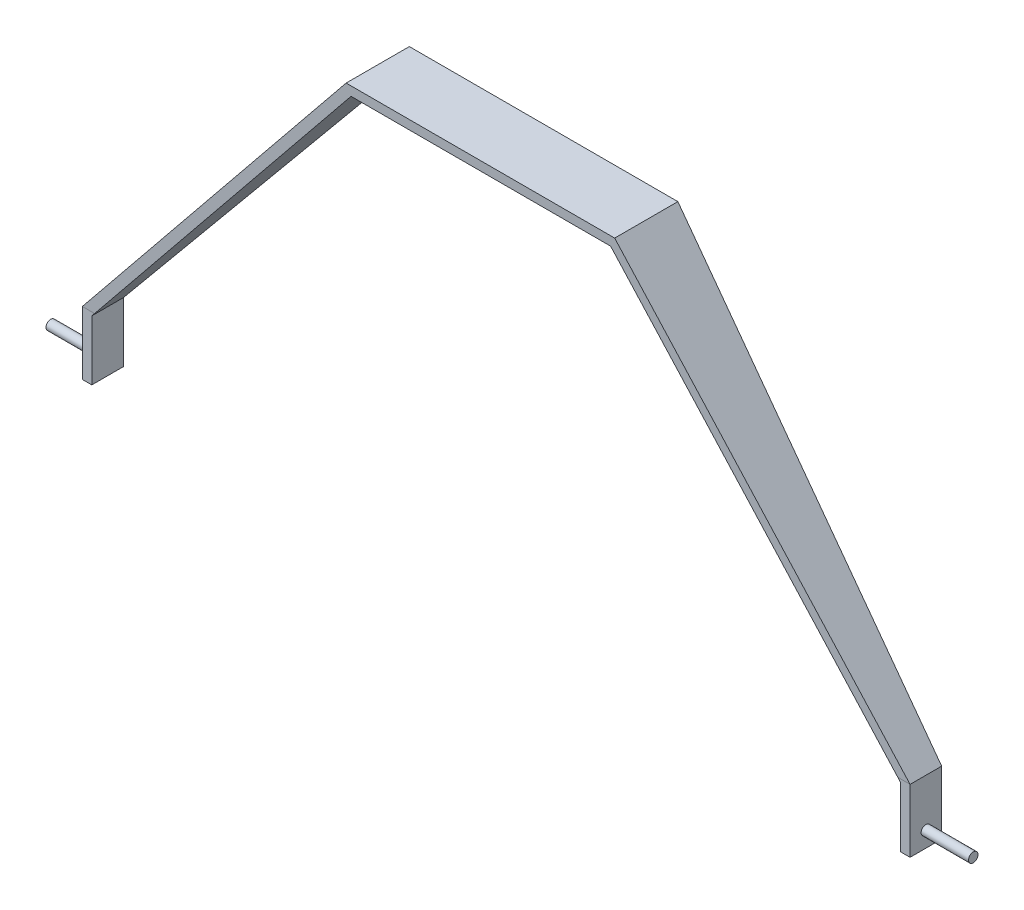
ISO-10303-21;
HEADER;
FILE_DESCRIPTION(('STEP AP214'),'2;1');
FILE_NAME('part.step','',(''),(''),'','','');
FILE_SCHEMA(('AUTOMOTIVE_DESIGN { 1 0 10303 214 1 1 1 1 }'));
ENDSEC;
DATA;
#1=APPLICATION_CONTEXT('core data for automotive mechanical design processes');
#2=APPLICATION_PROTOCOL_DEFINITION('international standard','automotive_design',2000,#1);
#3=PRODUCT_CONTEXT('',#1,'mechanical');
#4=PRODUCT('Part','Part','',(#3));
#5=PRODUCT_RELATED_PRODUCT_CATEGORY('part','',(#4));
#6=PRODUCT_DEFINITION_FORMATION('','',#4);
#7=PRODUCT_DEFINITION_CONTEXT('part definition',#1,'design');
#8=PRODUCT_DEFINITION('design','',#6,#7);
#9=PRODUCT_DEFINITION_SHAPE('','',#8);
#10=(LENGTH_UNIT() NAMED_UNIT(*) SI_UNIT(.MILLI.,.METRE.));
#11=(NAMED_UNIT(*) PLANE_ANGLE_UNIT() SI_UNIT($,.RADIAN.));
#12=(NAMED_UNIT(*) SI_UNIT($,.STERADIAN.) SOLID_ANGLE_UNIT());
#13=UNCERTAINTY_MEASURE_WITH_UNIT(LENGTH_MEASURE(1.E-05),#10,'distance_accuracy_value','');
#14=(GEOMETRIC_REPRESENTATION_CONTEXT(3) GLOBAL_UNCERTAINTY_ASSIGNED_CONTEXT((#13)) GLOBAL_UNIT_ASSIGNED_CONTEXT((#10,
#11,#12)) REPRESENTATION_CONTEXT('',''));
#15=CARTESIAN_POINT('',(0.,0.,0.));
#16=DIRECTION('',(0.,0.,1.));
#17=DIRECTION('',(1.,0.,0.));
#18=AXIS2_PLACEMENT_3D('',#15,#16,#17);
#19=CARTESIAN_POINT('',(0.,0.,20.));
#20=DIRECTION('',(0.,1.,0.));
#21=DIRECTION('',(0.,0.,1.));
#22=AXIS2_PLACEMENT_3D('',#19,#20,#21);
#23=PLANE('',#22);
#24=DIRECTION('',(1.,0.,0.));
#25=VECTOR('',#24,1.);
#26=CARTESIAN_POINT('',(0.,0.,0.));
#27=LINE('',#26,#25);
#28=CARTESIAN_POINT('',(-42.5,0.,0.));
#29=VERTEX_POINT('',#28);
#30=CARTESIAN_POINT('',(42.5,0.,0.));
#31=VERTEX_POINT('',#30);
#32=EDGE_CURVE('E183',#29,#31,#27,.T.);
#33=ORIENTED_EDGE('',*,*,#32,.F.);
#34=DIRECTION('',(0.,0.,-1.));
#35=VECTOR('',#34,1.);
#36=CARTESIAN_POINT('',(-42.5,0.,20.));
#37=LINE('',#36,#35);
#38=CARTESIAN_POINT('',(-42.5,0.,20.));
#39=VERTEX_POINT('',#38);
#40=EDGE_CURVE('E49',#39,#29,#37,.T.);
#41=ORIENTED_EDGE('',*,*,#40,.F.);
#42=DIRECTION('',(1.,0.,0.));
#43=VECTOR('',#42,1.);
#44=CARTESIAN_POINT('',(0.,0.,20.));
#45=LINE('',#44,#43);
#46=CARTESIAN_POINT('',(42.5,0.,20.));
#47=VERTEX_POINT('',#46);
#48=EDGE_CURVE('E187',#39,#47,#45,.T.);
#49=ORIENTED_EDGE('',*,*,#48,.T.);
#50=DIRECTION('',(0.,0.,-1.));
#51=VECTOR('',#50,1.);
#52=CARTESIAN_POINT('',(42.5,0.,20.));
#53=LINE('',#52,#51);
#54=EDGE_CURVE('E184',#47,#31,#53,.T.);
#55=ORIENTED_EDGE('',*,*,#54,.T.);
#56=EDGE_LOOP('',(#33,#41,#49,#55));
#57=FACE_BOUND('',#56,.T.);
#58=ADVANCED_FACE('F41',(#57),#23,.T.);
#59=CARTESIAN_POINT('',(-25.4264281592614,20.8355452971725,20.));
#60=DIRECTION('',(0.773478440465521,-0.633822610937024,0.));
#61=DIRECTION('',(0.633822610937024,0.773478440465521,0.));
#62=AXIS2_PLACEMENT_3D('',#59,#60,#61);
#63=PLANE('',#62);
#64=DIRECTION('',(0.,0.,-1.));
#65=VECTOR('',#64,1.);
#66=CARTESIAN_POINT('',(-131.,-108.,20.));
#67=LINE('',#66,#65);
#68=CARTESIAN_POINT('',(-131.,-108.,15.));
#69=VERTEX_POINT('',#68);
#70=CARTESIAN_POINT('',(-131.,-108.,5.));
#71=VERTEX_POINT('',#70);
#72=EDGE_CURVE('E165',#69,#71,#67,.T.);
#73=ORIENTED_EDGE('',*,*,#72,.F.);
#74=DIRECTION('',(0.633416626645473,0.772983002008035,0.0357862500929646));
#75=VECTOR('',#74,1.);
#76=CARTESIAN_POINT('',(-25.4482935262855,20.8088621374144,20.9633732471025));
#77=LINE('',#76,#75);
#78=EDGE_CURVE('E179',#69,#39,#77,.T.);
#79=ORIENTED_EDGE('',*,*,#78,.T.);
#80=ORIENTED_EDGE('',*,*,#40,.T.);
#81=DIRECTION('',(-0.633416626645473,-0.772983002008035,0.0357862500929646));
#82=VECTOR('',#81,1.);
#83=CARTESIAN_POINT('',(-25.901645642569,20.255618876865,-0.937760133188189));
#84=LINE('',#83,#82);
#85=EDGE_CURVE('E178',#29,#71,#84,.T.);
#86=ORIENTED_EDGE('',*,*,#85,.T.);
#87=EDGE_LOOP('',(#73,#79,#80,#86));
#88=FACE_BOUND('',#87,.T.);
#89=ADVANCED_FACE('F177',(#88),#63,.F.);
#90=CARTESIAN_POINT('',(-131.,0.,20.));
#91=DIRECTION('',(1.,0.,0.));
#92=DIRECTION('',(0.,0.,-1.));
#93=AXIS2_PLACEMENT_3D('',#90,#91,#92);
#94=PLANE('',#93);
#95=CARTESIAN_POINT('',(-131.,-123.,10.));
#96=DIRECTION('',(1.,0.,0.));
#97=DIRECTION('',(0.,0.,-1.));
#98=AXIS2_PLACEMENT_3D('',#95,#96,#97);
#99=CIRCLE('',#98,1.5);
#100=CARTESIAN_POINT('',(-131.,-123.,8.5));
#101=VERTEX_POINT('',#100);
#102=EDGE_CURVE('E11',#101,#101,#99,.F.);
#103=ORIENTED_EDGE('',*,*,#102,.F.);
#104=EDGE_LOOP('',(#103));
#105=FACE_BOUND('',#104,.T.);
#106=DIRECTION('',(0.,0.,-1.));
#107=VECTOR('',#106,1.);
#108=CARTESIAN_POINT('',(-131.,-128.,20.));
#109=LINE('',#108,#107);
#110=CARTESIAN_POINT('',(-131.,-128.,15.));
#111=VERTEX_POINT('',#110);
#112=CARTESIAN_POINT('',(-131.,-128.,5.));
#113=VERTEX_POINT('',#112);
#114=EDGE_CURVE('E156',#111,#113,#109,.T.);
#115=ORIENTED_EDGE('',*,*,#114,.F.);
#116=DIRECTION('',(0.,1.,0.));
#117=VECTOR('',#116,1.);
#118=CARTESIAN_POINT('',(-131.,0.,15.));
#119=LINE('',#118,#117);
#120=EDGE_CURVE('E137',#111,#69,#119,.T.);
#121=ORIENTED_EDGE('',*,*,#120,.T.);
#122=ORIENTED_EDGE('',*,*,#72,.T.);
#123=DIRECTION('',(0.,-1.,0.));
#124=VECTOR('',#123,1.);
#125=CARTESIAN_POINT('',(-131.,0.,5.00000000000001));
#126=LINE('',#125,#124);
#127=EDGE_CURVE('E164',#71,#113,#126,.T.);
#128=ORIENTED_EDGE('',*,*,#127,.T.);
#129=EDGE_LOOP('',(#115,#121,#122,#128));
#130=FACE_BOUND('',#129,.T.);
#131=ADVANCED_FACE('F162',(#105,#130),#94,.F.);
#132=CARTESIAN_POINT('',(0.,-128.,20.));
#133=DIRECTION('',(0.,1.,0.));
#134=DIRECTION('',(0.,0.,1.));
#135=AXIS2_PLACEMENT_3D('',#132,#133,#134);
#136=PLANE('',#135);
#137=DIRECTION('',(0.,0.,-1.));
#138=VECTOR('',#137,1.);
#139=CARTESIAN_POINT('',(-128.,-128.,20.));
#140=LINE('',#139,#138);
#141=CARTESIAN_POINT('',(-128.,-128.,15.));
#142=VERTEX_POINT('',#141);
#143=CARTESIAN_POINT('',(-128.,-128.,5.));
#144=VERTEX_POINT('',#143);
#145=EDGE_CURVE('E158',#142,#144,#140,.T.);
#146=ORIENTED_EDGE('',*,*,#145,.F.);
#147=DIRECTION('',(1.,0.,0.));
#148=VECTOR('',#147,1.);
#149=CARTESIAN_POINT('',(-131.,-128.,15.));
#150=LINE('',#149,#148);
#151=EDGE_CURVE('E140',#111,#142,#150,.T.);
#152=ORIENTED_EDGE('',*,*,#151,.F.);
#153=ORIENTED_EDGE('',*,*,#114,.T.);
#154=DIRECTION('',(1.,0.,0.));
#155=VECTOR('',#154,1.);
#156=CARTESIAN_POINT('',(-131.,-128.,5.));
#157=LINE('',#156,#155);
#158=EDGE_CURVE('E281',#113,#144,#157,.T.);
#159=ORIENTED_EDGE('',*,*,#158,.T.);
#160=EDGE_LOOP('',(#146,#152,#153,#159));
#161=FACE_BOUND('',#160,.T.);
#162=ADVANCED_FACE('F154',(#161),#136,.F.);
#163=CARTESIAN_POINT('',(-128.,0.,20.));
#164=DIRECTION('',(-1.,0.,0.));
#165=DIRECTION('',(0.,0.,1.));
#166=AXIS2_PLACEMENT_3D('',#163,#164,#165);
#167=PLANE('',#166);
#168=DIRECTION('',(0.,0.,-1.));
#169=VECTOR('',#168,1.);
#170=CARTESIAN_POINT('',(-128.,-109.072168564007,20.));
#171=LINE('',#170,#169);
#172=CARTESIAN_POINT('',(-128.,-109.072168564007,15.));
#173=VERTEX_POINT('',#172);
#174=CARTESIAN_POINT('',(-128.,-109.072168564007,5.));
#175=VERTEX_POINT('',#174);
#176=EDGE_CURVE('E168',#173,#175,#171,.T.);
#177=ORIENTED_EDGE('',*,*,#176,.F.);
#178=DIRECTION('',(0.,-1.,0.));
#179=VECTOR('',#178,1.);
#180=CARTESIAN_POINT('',(-128.,0.,15.));
#181=LINE('',#180,#179);
#182=EDGE_CURVE('E188',#173,#142,#181,.T.);
#183=ORIENTED_EDGE('',*,*,#182,.T.);
#184=ORIENTED_EDGE('',*,*,#145,.T.);
#185=DIRECTION('',(0.,1.,0.));
#186=VECTOR('',#185,1.);
#187=CARTESIAN_POINT('',(-128.,0.,5.00000000000001));
#188=LINE('',#187,#186);
#189=EDGE_CURVE('E225',#144,#175,#188,.T.);
#190=ORIENTED_EDGE('',*,*,#189,.T.);
#191=EDGE_LOOP('',(#177,#183,#184,#190));
#192=FACE_BOUND('',#191,.T.);
#193=ADVANCED_FACE('F224',(#192),#167,.F.);
#194=CARTESIAN_POINT('',(-23.1059928378648,18.9340774643614,20.));
#195=DIRECTION('',(-0.773478440465521,0.633822610937024,0.));
#196=DIRECTION('',(-0.633822610937024,-0.773478440465521,0.));
#197=AXIS2_PLACEMENT_3D('',#194,#195,#196);
#198=PLANE('',#197);
#199=DIRECTION('',(0.,0.,-1.));
#200=VECTOR('',#199,1.);
#201=CARTESIAN_POINT('',(-41.0797507600499,-3.00000000000002,20.));
#202=LINE('',#201,#200);
#203=CARTESIAN_POINT('',(-41.0797507600499,-3.00000000000002,19.8611111111111));
#204=VERTEX_POINT('',#203);
#205=CARTESIAN_POINT('',(-41.0797507600499,-3.00000000000002,0.13888888888889));
#206=VERTEX_POINT('',#205);
#207=EDGE_CURVE('E210',#204,#206,#202,.T.);
#208=ORIENTED_EDGE('',*,*,#207,.F.);
#209=DIRECTION('',(-0.633416626645473,-0.772983002008035,-0.0357862500929646));
#210=VECTOR('',#209,1.);
#211=CARTESIAN_POINT('',(-23.125862754736,18.9098294302136,20.8754550662136));
#212=LINE('',#211,#210);
#213=CARTESIAN_POINT('',(-127.121417426717,-108.,15.));
#214=VERTEX_POINT('',#213);
#215=EDGE_CURVE('E261',#204,#214,#212,.T.);
#216=ORIENTED_EDGE('',*,*,#215,.T.);
#217=DIRECTION('',(-0.633822610937024,-0.773478440465521,0.));
#218=VECTOR('',#217,1.);
#219=CARTESIAN_POINT('',(-23.1059928378648,18.9340774643614,15.));
#220=LINE('',#219,#218);
#221=EDGE_CURVE('E191',#214,#173,#220,.T.);
#222=ORIENTED_EDGE('',*,*,#221,.T.);
#223=ORIENTED_EDGE('',*,*,#176,.T.);
#224=DIRECTION('',(0.633822610937024,0.773478440465521,0.));
#225=VECTOR('',#224,1.);
#226=CARTESIAN_POINT('',(-23.1059928378648,18.9340774643614,5.00000000000001));
#227=LINE('',#226,#225);
#228=CARTESIAN_POINT('',(-127.121417426717,-108.,5.));
#229=VERTEX_POINT('',#228);
#230=EDGE_CURVE('E220',#175,#229,#227,.T.);
#231=ORIENTED_EDGE('',*,*,#230,.T.);
#232=DIRECTION('',(0.633416626645473,0.772983002008035,-0.0357862500929646));
#233=VECTOR('',#232,1.);
#234=CARTESIAN_POINT('',(-23.5792148710195,18.3565861696642,-0.849841952299268));
#235=LINE('',#234,#233);
#236=EDGE_CURVE('E269',#229,#206,#235,.T.);
#237=ORIENTED_EDGE('',*,*,#236,.T.);
#238=EDGE_LOOP('',(#208,#216,#222,#223,#231,#237));
#239=FACE_BOUND('',#238,.T.);
#240=ADVANCED_FACE('F218',(#239),#198,.F.);
#241=CARTESIAN_POINT('',(0.,-3.00000000000002,20.));
#242=DIRECTION('',(0.,-1.,0.));
#243=DIRECTION('',(0.,0.,-1.));
#244=AXIS2_PLACEMENT_3D('',#241,#242,#243);
#245=PLANE('',#244);
#246=DIRECTION('',(1.,0.,0.));
#247=VECTOR('',#246,1.);
#248=CARTESIAN_POINT('',(0.,-3.00000000000002,19.8611111111111));
#249=LINE('',#248,#247);
#250=CARTESIAN_POINT('',(41.0797507600499,-3.00000000000001,19.8611111111111));
#251=VERTEX_POINT('',#250);
#252=EDGE_CURVE('E263',#204,#251,#249,.T.);
#253=ORIENTED_EDGE('',*,*,#252,.F.);
#254=ORIENTED_EDGE('',*,*,#207,.T.);
#255=DIRECTION('',(-1.,0.,0.));
#256=VECTOR('',#255,1.);
#257=CARTESIAN_POINT('',(0.,-3.00000000000002,0.13888888888889));
#258=LINE('',#257,#256);
#259=CARTESIAN_POINT('',(41.0797507600499,-3.00000000000001,0.138888888888889));
#260=VERTEX_POINT('',#259);
#261=EDGE_CURVE('E271',#260,#206,#258,.T.);
#262=ORIENTED_EDGE('',*,*,#261,.F.);
#263=DIRECTION('',(0.,0.,-1.));
#264=VECTOR('',#263,1.);
#265=CARTESIAN_POINT('',(41.0797507600499,-3.00000000000002,20.));
#266=LINE('',#265,#264);
#267=EDGE_CURVE('E207',#251,#260,#266,.T.);
#268=ORIENTED_EDGE('',*,*,#267,.F.);
#269=EDGE_LOOP('',(#253,#254,#262,#268));
#270=FACE_BOUND('',#269,.T.);
#271=ADVANCED_FACE('F342',(#270),#245,.T.);
#272=CARTESIAN_POINT('',(23.1059928378648,18.9340774643614,20.));
#273=DIRECTION('',(-0.773478440465521,-0.633822610937024,0.));
#274=DIRECTION('',(0.633822610937024,-0.773478440465521,0.));
#275=AXIS2_PLACEMENT_3D('',#272,#273,#274);
#276=PLANE('',#275);
#277=DIRECTION('',(0.633416626645473,-0.772983002008035,-0.0357862500929646));
#278=VECTOR('',#277,1.);
#279=CARTESIAN_POINT('',(23.125862754736,18.9098294302136,20.8754550662136));
#280=LINE('',#279,#278);
#281=CARTESIAN_POINT('',(127.121417426717,-108.,15.));
#282=VERTEX_POINT('',#281);
#283=EDGE_CURVE('E265',#251,#282,#280,.T.);
#284=ORIENTED_EDGE('',*,*,#283,.F.);
#285=ORIENTED_EDGE('',*,*,#267,.T.);
#286=DIRECTION('',(-0.633416626645473,0.772983002008035,-0.0357862500929646));
#287=VECTOR('',#286,1.);
#288=CARTESIAN_POINT('',(23.5792148710195,18.3565861696642,-0.849841952299268));
#289=LINE('',#288,#287);
#290=CARTESIAN_POINT('',(127.121417426717,-108.,5.));
#291=VERTEX_POINT('',#290);
#292=EDGE_CURVE('E253',#291,#260,#289,.T.);
#293=ORIENTED_EDGE('',*,*,#292,.F.);
#294=DIRECTION('',(-0.633822610937024,0.773478440465521,0.));
#295=VECTOR('',#294,1.);
#296=CARTESIAN_POINT('',(23.1059928378648,18.9340774643614,5.00000000000001));
#297=LINE('',#296,#295);
#298=CARTESIAN_POINT('',(128.,-109.072168564007,5.));
#299=VERTEX_POINT('',#298);
#300=EDGE_CURVE('E231',#299,#291,#297,.T.);
#301=ORIENTED_EDGE('',*,*,#300,.F.);
#302=DIRECTION('',(0.,0.,-1.));
#303=VECTOR('',#302,1.);
#304=CARTESIAN_POINT('',(128.,-109.072168564007,20.));
#305=LINE('',#304,#303);
#306=CARTESIAN_POINT('',(128.,-109.072168564007,15.));
#307=VERTEX_POINT('',#306);
#308=EDGE_CURVE('E204',#307,#299,#305,.T.);
#309=ORIENTED_EDGE('',*,*,#308,.F.);
#310=DIRECTION('',(0.633822610937024,-0.773478440465521,0.));
#311=VECTOR('',#310,1.);
#312=CARTESIAN_POINT('',(23.1059928378648,18.9340774643614,15.));
#313=LINE('',#312,#311);
#314=EDGE_CURVE('E229',#282,#307,#313,.T.);
#315=ORIENTED_EDGE('',*,*,#314,.F.);
#316=EDGE_LOOP('',(#284,#285,#293,#301,#309,#315));
#317=FACE_BOUND('',#316,.T.);
#318=ADVANCED_FACE('F251',(#317),#276,.T.);
#319=CARTESIAN_POINT('',(128.,0.,20.));
#320=DIRECTION('',(-1.,0.,0.));
#321=DIRECTION('',(0.,0.,1.));
#322=AXIS2_PLACEMENT_3D('',#319,#320,#321);
#323=PLANE('',#322);
#324=DIRECTION('',(0.,-1.,0.));
#325=VECTOR('',#324,1.);
#326=CARTESIAN_POINT('',(128.,0.,15.));
#327=LINE('',#326,#325);
#328=CARTESIAN_POINT('',(128.,-128.,15.));
#329=VERTEX_POINT('',#328);
#330=EDGE_CURVE('E227',#307,#329,#327,.T.);
#331=ORIENTED_EDGE('',*,*,#330,.F.);
#332=ORIENTED_EDGE('',*,*,#308,.T.);
#333=DIRECTION('',(0.,1.,0.));
#334=VECTOR('',#333,1.);
#335=CARTESIAN_POINT('',(128.,0.,5.00000000000001));
#336=LINE('',#335,#334);
#337=CARTESIAN_POINT('',(128.,-128.,5.));
#338=VERTEX_POINT('',#337);
#339=EDGE_CURVE('E257',#338,#299,#336,.T.);
#340=ORIENTED_EDGE('',*,*,#339,.F.);
#341=DIRECTION('',(0.,0.,-1.));
#342=VECTOR('',#341,1.);
#343=CARTESIAN_POINT('',(128.,-128.,20.));
#344=LINE('',#343,#342);
#345=EDGE_CURVE('E201',#329,#338,#344,.T.);
#346=ORIENTED_EDGE('',*,*,#345,.F.);
#347=EDGE_LOOP('',(#331,#332,#340,#346));
#348=FACE_BOUND('',#347,.T.);
#349=ADVANCED_FACE('F248',(#348),#323,.T.);
#350=CARTESIAN_POINT('',(0.,-128.,20.));
#351=DIRECTION('',(0.,-1.,0.));
#352=DIRECTION('',(0.,0.,-1.));
#353=AXIS2_PLACEMENT_3D('',#350,#351,#352);
#354=PLANE('',#353);
#355=CARTESIAN_POINT('',(131.,-128.,15.));
#356=VERTEX_POINT('',#355);
#357=EDGE_CURVE('E148',#329,#356,#150,.T.);
#358=ORIENTED_EDGE('',*,*,#357,.F.);
#359=ORIENTED_EDGE('',*,*,#345,.T.);
#360=CARTESIAN_POINT('',(131.,-128.,5.));
#361=VERTEX_POINT('',#360);
#362=EDGE_CURVE('E279',#338,#361,#157,.T.);
#363=ORIENTED_EDGE('',*,*,#362,.T.);
#364=DIRECTION('',(0.,0.,-1.));
#365=VECTOR('',#364,1.);
#366=CARTESIAN_POINT('',(131.,-128.,20.));
#367=LINE('',#366,#365);
#368=EDGE_CURVE('E198',#356,#361,#367,.T.);
#369=ORIENTED_EDGE('',*,*,#368,.F.);
#370=EDGE_LOOP('',(#358,#359,#363,#369));
#371=FACE_BOUND('',#370,.T.);
#372=ADVANCED_FACE('F365',(#371),#354,.T.);
#373=CARTESIAN_POINT('',(131.,0.,20.));
#374=DIRECTION('',(1.,0.,0.));
#375=DIRECTION('',(0.,0.,-1.));
#376=AXIS2_PLACEMENT_3D('',#373,#374,#375);
#377=PLANE('',#376);
#378=CARTESIAN_POINT('',(131.,-123.,10.));
#379=DIRECTION('',(1.,0.,0.));
#380=DIRECTION('',(0.,0.,-1.));
#381=AXIS2_PLACEMENT_3D('',#378,#379,#380);
#382=CIRCLE('',#381,1.5);
#383=CARTESIAN_POINT('',(131.,-123.,8.5));
#384=VERTEX_POINT('',#383);
#385=EDGE_CURVE('E289',#384,#384,#382,.T.);
#386=ORIENTED_EDGE('',*,*,#385,.F.);
#387=EDGE_LOOP('',(#386));
#388=FACE_BOUND('',#387,.T.);
#389=DIRECTION('',(0.,1.,0.));
#390=VECTOR('',#389,1.);
#391=CARTESIAN_POINT('',(131.,0.,15.));
#392=LINE('',#391,#390);
#393=CARTESIAN_POINT('',(131.,-108.,15.));
#394=VERTEX_POINT('',#393);
#395=EDGE_CURVE('E149',#356,#394,#392,.T.);
#396=ORIENTED_EDGE('',*,*,#395,.F.);
#397=ORIENTED_EDGE('',*,*,#368,.T.);
#398=DIRECTION('',(0.,-1.,0.));
#399=VECTOR('',#398,1.);
#400=CARTESIAN_POINT('',(131.,0.,5.00000000000001));
#401=LINE('',#400,#399);
#402=CARTESIAN_POINT('',(131.,-108.,5.));
#403=VERTEX_POINT('',#402);
#404=EDGE_CURVE('E283',#403,#361,#401,.T.);
#405=ORIENTED_EDGE('',*,*,#404,.F.);
#406=DIRECTION('',(0.,0.,-1.));
#407=VECTOR('',#406,1.);
#408=CARTESIAN_POINT('',(131.,-108.,20.));
#409=LINE('',#408,#407);
#410=EDGE_CURVE('E195',#394,#403,#409,.T.);
#411=ORIENTED_EDGE('',*,*,#410,.F.);
#412=EDGE_LOOP('',(#396,#397,#405,#411));
#413=FACE_BOUND('',#412,.T.);
#414=ADVANCED_FACE('F373',(#388,#413),#377,.T.);
#415=CARTESIAN_POINT('',(25.4264281592614,20.8355452971725,20.));
#416=DIRECTION('',(0.773478440465521,0.633822610937024,0.));
#417=DIRECTION('',(-0.633822610937024,0.773478440465521,0.));
#418=AXIS2_PLACEMENT_3D('',#415,#416,#417);
#419=PLANE('',#418);
#420=DIRECTION('',(-0.633416626645473,0.772983002008035,0.0357862500929646));
#421=VECTOR('',#420,1.);
#422=CARTESIAN_POINT('',(25.4482935262855,20.8088621374144,20.9633732471025));
#423=LINE('',#422,#421);
#424=EDGE_CURVE('E55',#394,#47,#423,.T.);
#425=ORIENTED_EDGE('',*,*,#424,.F.);
#426=ORIENTED_EDGE('',*,*,#410,.T.);
#427=DIRECTION('',(0.633416626645473,-0.772983002008035,0.0357862500929646));
#428=VECTOR('',#427,1.);
#429=CARTESIAN_POINT('',(25.901645642569,20.255618876865,-0.937760133188189));
#430=LINE('',#429,#428);
#431=EDGE_CURVE('E274',#31,#403,#430,.T.);
#432=ORIENTED_EDGE('',*,*,#431,.F.);
#433=ORIENTED_EDGE('',*,*,#54,.F.);
#434=EDGE_LOOP('',(#425,#426,#432,#433));
#435=FACE_BOUND('',#434,.T.);
#436=ADVANCED_FACE('F380',(#435),#419,.T.);
#437=CARTESIAN_POINT('',(-131.,0.,5.00000000000001));
#438=DIRECTION('',(0.,0.,1.));
#439=DIRECTION('',(0.,-1.,0.));
#440=AXIS2_PLACEMENT_3D('',#437,#438,#439);
#441=PLANE('',#440);
#442=ORIENTED_EDGE('',*,*,#158,.F.);
#443=ORIENTED_EDGE('',*,*,#127,.F.);
#444=DIRECTION('',(1.,0.,0.));
#445=VECTOR('',#444,1.);
#446=CARTESIAN_POINT('',(-131.,-108.,5.));
#447=LINE('',#446,#445);
#448=EDGE_CURVE('E276',#71,#229,#447,.T.);
#449=ORIENTED_EDGE('',*,*,#448,.T.);
#450=ORIENTED_EDGE('',*,*,#230,.F.);
#451=ORIENTED_EDGE('',*,*,#189,.F.);
#452=EDGE_LOOP('',(#442,#443,#449,#450,#451));
#453=FACE_BOUND('',#452,.T.);
#454=ADVANCED_FACE('F384',(#453),#441,.F.);
#455=CARTESIAN_POINT('',(-131.,0.,0.));
#456=DIRECTION('',(0.,0.0462467613948889,0.9989300461296));
#457=DIRECTION('',(0.,-0.9989300461296,0.0462467613948889));
#458=AXIS2_PLACEMENT_3D('',#455,#456,#457);
#459=PLANE('',#458);
#460=ORIENTED_EDGE('',*,*,#32,.T.);
#461=ORIENTED_EDGE('',*,*,#431,.T.);
#462=EDGE_CURVE('E280',#291,#403,#447,.T.);
#463=ORIENTED_EDGE('',*,*,#462,.F.);
#464=ORIENTED_EDGE('',*,*,#292,.T.);
#465=ORIENTED_EDGE('',*,*,#261,.T.);
#466=ORIENTED_EDGE('',*,*,#236,.F.);
#467=ORIENTED_EDGE('',*,*,#448,.F.);
#468=ORIENTED_EDGE('',*,*,#85,.F.);
#469=EDGE_LOOP('',(#460,#461,#463,#464,#465,#466,#467,#468));
#470=FACE_BOUND('',#469,.T.);
#471=ADVANCED_FACE('F393',(#470),#459,.F.);
#472=ORIENTED_EDGE('',*,*,#300,.T.);
#473=ORIENTED_EDGE('',*,*,#462,.T.);
#474=ORIENTED_EDGE('',*,*,#404,.T.);
#475=ORIENTED_EDGE('',*,*,#362,.F.);
#476=ORIENTED_EDGE('',*,*,#339,.T.);
#477=EDGE_LOOP('',(#472,#473,#474,#475,#476));
#478=FACE_BOUND('',#477,.T.);
#479=ADVANCED_FACE('F395',(#478),#441,.F.);
#480=CARTESIAN_POINT('',(-131.,0.,15.));
#481=DIRECTION('',(0.,0.,-1.));
#482=DIRECTION('',(-1.,0.,0.));
#483=AXIS2_PLACEMENT_3D('',#480,#481,#482);
#484=PLANE('',#483);
#485=ORIENTED_EDGE('',*,*,#221,.F.);
#486=DIRECTION('',(1.,0.,0.));
#487=VECTOR('',#486,1.);
#488=CARTESIAN_POINT('',(-131.,-108.,15.));
#489=LINE('',#488,#487);
#490=EDGE_CURVE('E143',#69,#214,#489,.T.);
#491=ORIENTED_EDGE('',*,*,#490,.F.);
#492=ORIENTED_EDGE('',*,*,#120,.F.);
#493=ORIENTED_EDGE('',*,*,#151,.T.);
#494=ORIENTED_EDGE('',*,*,#182,.F.);
#495=EDGE_LOOP('',(#485,#491,#492,#493,#494));
#496=FACE_BOUND('',#495,.T.);
#497=ADVANCED_FACE('F139',(#496),#484,.F.);
#498=CARTESIAN_POINT('',(-131.,-0.923945589870819,19.9572247412097));
#499=DIRECTION('',(0.,0.0462467613948889,-0.9989300461296));
#500=DIRECTION('',(0.,0.9989300461296,0.0462467613948889));
#501=AXIS2_PLACEMENT_3D('',#498,#499,#500);
#502=PLANE('',#501);
#503=ORIENTED_EDGE('',*,*,#490,.T.);
#504=ORIENTED_EDGE('',*,*,#215,.F.);
#505=ORIENTED_EDGE('',*,*,#252,.T.);
#506=ORIENTED_EDGE('',*,*,#283,.T.);
#507=EDGE_CURVE('E159',#282,#394,#489,.T.);
#508=ORIENTED_EDGE('',*,*,#507,.T.);
#509=ORIENTED_EDGE('',*,*,#424,.T.);
#510=ORIENTED_EDGE('',*,*,#48,.F.);
#511=ORIENTED_EDGE('',*,*,#78,.F.);
#512=EDGE_LOOP('',(#503,#504,#505,#506,#508,#509,#510,#511));
#513=FACE_BOUND('',#512,.T.);
#514=ADVANCED_FACE('F415',(#513),#502,.F.);
#515=ORIENTED_EDGE('',*,*,#314,.T.);
#516=ORIENTED_EDGE('',*,*,#330,.T.);
#517=ORIENTED_EDGE('',*,*,#357,.T.);
#518=ORIENTED_EDGE('',*,*,#395,.T.);
#519=ORIENTED_EDGE('',*,*,#507,.F.);
#520=EDGE_LOOP('',(#515,#516,#517,#518,#519));
#521=FACE_BOUND('',#520,.T.);
#522=ADVANCED_FACE('F240',(#521),#484,.F.);
#523=CARTESIAN_POINT('',(146.,-123.,10.));
#524=DIRECTION('',(-1.,0.,0.));
#525=DIRECTION('',(0.,0.,1.));
#526=AXIS2_PLACEMENT_3D('',#523,#524,#525);
#527=CYLINDRICAL_SURFACE('',#526,1.5);
#528=CARTESIAN_POINT('',(146.,-123.,10.));
#529=DIRECTION('',(1.,0.,0.));
#530=DIRECTION('',(0.,0.,-1.));
#531=AXIS2_PLACEMENT_3D('',#528,#529,#530);
#532=CIRCLE('',#531,1.5);
#533=CARTESIAN_POINT('',(146.,-123.,8.5));
#534=VERTEX_POINT('',#533);
#535=EDGE_CURVE('E285',#534,#534,#532,.T.);
#536=ORIENTED_EDGE('',*,*,#535,.F.);
#537=EDGE_LOOP('',(#536));
#538=FACE_BOUND('',#537,.T.);
#539=ORIENTED_EDGE('',*,*,#385,.T.);
#540=EDGE_LOOP('',(#539));
#541=FACE_BOUND('',#540,.T.);
#542=ADVANCED_FACE('F430',(#538,#541),#527,.T.);
#543=CARTESIAN_POINT('',(146.,-123.,10.));
#544=DIRECTION('',(1.,0.,0.));
#545=DIRECTION('',(0.,0.,-1.));
#546=AXIS2_PLACEMENT_3D('',#543,#544,#545);
#547=PLANE('',#546);
#548=ORIENTED_EDGE('',*,*,#535,.T.);
#549=EDGE_LOOP('',(#548));
#550=FACE_BOUND('',#549,.T.);
#551=ADVANCED_FACE('F303',(#550),#547,.T.);
#552=CARTESIAN_POINT('',(-146.,-123.,10.));
#553=DIRECTION('',(1.,0.,0.));
#554=DIRECTION('',(0.,0.,-1.));
#555=AXIS2_PLACEMENT_3D('',#552,#553,#554);
#556=CYLINDRICAL_SURFACE('',#555,1.5);
#557=CARTESIAN_POINT('',(-146.,-123.,10.));
#558=DIRECTION('',(-1.,0.,0.));
#559=DIRECTION('',(0.,0.,1.));
#560=AXIS2_PLACEMENT_3D('',#557,#558,#559);
#561=CIRCLE('',#560,1.5);
#562=CARTESIAN_POINT('',(-146.,-123.,11.5));
#563=VERTEX_POINT('',#562);
#564=EDGE_CURVE('E292',#563,#563,#561,.T.);
#565=ORIENTED_EDGE('',*,*,#564,.F.);
#566=EDGE_LOOP('',(#565));
#567=FACE_BOUND('',#566,.T.);
#568=ORIENTED_EDGE('',*,*,#102,.T.);
#569=EDGE_LOOP('',(#568));
#570=FACE_BOUND('',#569,.T.);
#571=ADVANCED_FACE('F300',(#567,#570),#556,.T.);
#572=CARTESIAN_POINT('',(-146.,-123.,10.));
#573=DIRECTION('',(-1.,0.,0.));
#574=DIRECTION('',(0.,0.,1.));
#575=AXIS2_PLACEMENT_3D('',#572,#573,#574);
#576=PLANE('',#575);
#577=ORIENTED_EDGE('',*,*,#564,.T.);
#578=EDGE_LOOP('',(#577));
#579=FACE_BOUND('',#578,.T.);
#580=ADVANCED_FACE('F298',(#579),#576,.T.);
#581=CLOSED_SHELL('',(#58,#89,#131,#162,#193,#240,#271,#318,#349,#372,#414,#436,#454,#471,#479,
#497,#514,#522,#542,#551,#571,#580));
#582=MANIFOLD_SOLID_BREP('B2',#581);
#583=ADVANCED_BREP_SHAPE_REPRESENTATION('',(#18,#582),#14);
#584=SHAPE_DEFINITION_REPRESENTATION(#9,#583);
ENDSEC;
END-ISO-10303-21;
